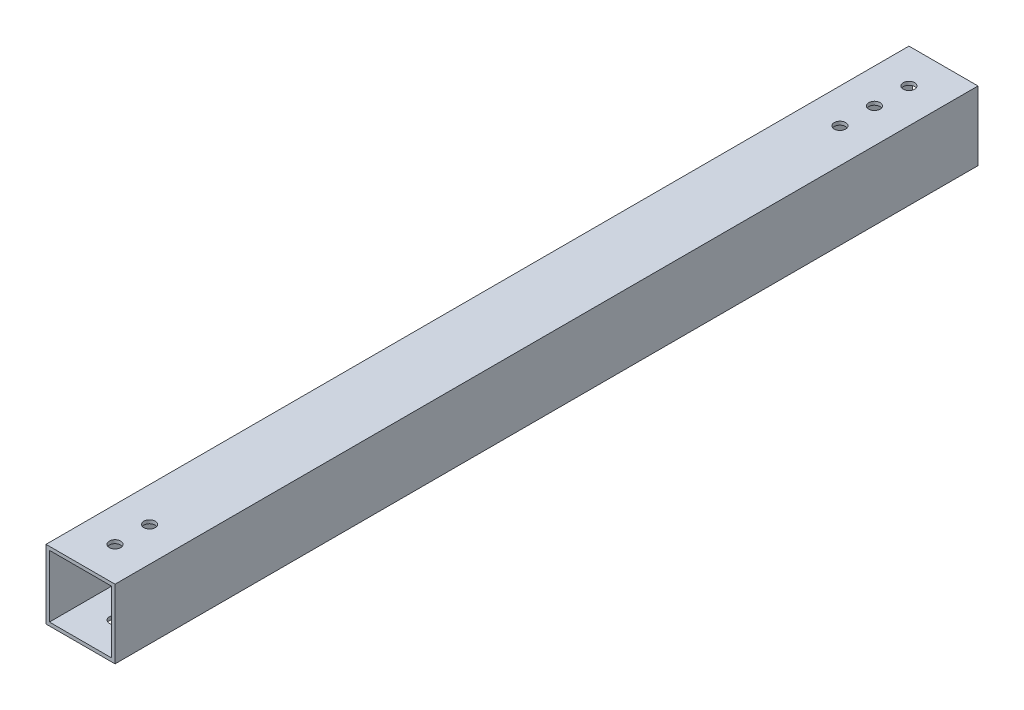
ISO-10303-21;
HEADER;
FILE_DESCRIPTION(('STEP AP214'),'2;1');
FILE_NAME('part.step','',(''),(''),'','','');
FILE_SCHEMA(('AUTOMOTIVE_DESIGN { 1 0 10303 214 1 1 1 1 }'));
ENDSEC;
DATA;
#1=APPLICATION_CONTEXT('core data for automotive mechanical design processes');
#2=APPLICATION_PROTOCOL_DEFINITION('international standard','automotive_design',2000,#1);
#3=PRODUCT_CONTEXT('',#1,'mechanical');
#4=PRODUCT('Part','Part','',(#3));
#5=PRODUCT_RELATED_PRODUCT_CATEGORY('part','',(#4));
#6=PRODUCT_DEFINITION_FORMATION('','',#4);
#7=PRODUCT_DEFINITION_CONTEXT('part definition',#1,'design');
#8=PRODUCT_DEFINITION('design','',#6,#7);
#9=PRODUCT_DEFINITION_SHAPE('','',#8);
#10=(LENGTH_UNIT() NAMED_UNIT(*) SI_UNIT(.MILLI.,.METRE.));
#11=(NAMED_UNIT(*) PLANE_ANGLE_UNIT() SI_UNIT($,.RADIAN.));
#12=(NAMED_UNIT(*) SI_UNIT($,.STERADIAN.) SOLID_ANGLE_UNIT());
#13=UNCERTAINTY_MEASURE_WITH_UNIT(LENGTH_MEASURE(1.E-05),#10,'distance_accuracy_value','');
#14=(GEOMETRIC_REPRESENTATION_CONTEXT(3) GLOBAL_UNCERTAINTY_ASSIGNED_CONTEXT((#13)) GLOBAL_UNIT_ASSIGNED_CONTEXT((#10,
#11,#12)) REPRESENTATION_CONTEXT('',''));
#15=CARTESIAN_POINT('',(0.,0.,0.));
#16=DIRECTION('',(0.,0.,1.));
#17=DIRECTION('',(1.,0.,0.));
#18=AXIS2_PLACEMENT_3D('',#15,#16,#17);
#19=CARTESIAN_POINT('',(0.,0.,250.));
#20=DIRECTION('',(0.,0.,1.));
#21=DIRECTION('',(1.,0.,0.));
#22=AXIS2_PLACEMENT_3D('',#19,#20,#21);
#23=PLANE('',#22);
#24=DIRECTION('',(0.,1.,0.));
#25=VECTOR('',#24,1.);
#26=CARTESIAN_POINT('',(10.,10.,250.));
#27=LINE('',#26,#25);
#28=CARTESIAN_POINT('',(10.,-10.,250.));
#29=VERTEX_POINT('',#28);
#30=CARTESIAN_POINT('',(10.,10.,250.));
#31=VERTEX_POINT('',#30);
#32=EDGE_CURVE('E146',#29,#31,#27,.T.);
#33=ORIENTED_EDGE('',*,*,#32,.T.);
#34=DIRECTION('',(-1.,0.,0.));
#35=VECTOR('',#34,1.);
#36=CARTESIAN_POINT('',(-10.,10.,250.));
#37=LINE('',#36,#35);
#38=CARTESIAN_POINT('',(-10.,10.,250.));
#39=VERTEX_POINT('',#38);
#40=EDGE_CURVE('E149',#31,#39,#37,.T.);
#41=ORIENTED_EDGE('',*,*,#40,.T.);
#42=DIRECTION('',(0.,-1.,0.));
#43=VECTOR('',#42,1.);
#44=CARTESIAN_POINT('',(-10.,10.,250.));
#45=LINE('',#44,#43);
#46=CARTESIAN_POINT('',(-10.,-10.,250.));
#47=VERTEX_POINT('',#46);
#48=EDGE_CURVE('E152',#39,#47,#45,.T.);
#49=ORIENTED_EDGE('',*,*,#48,.T.);
#50=DIRECTION('',(1.,0.,0.));
#51=VECTOR('',#50,1.);
#52=CARTESIAN_POINT('',(-10.,-10.,250.));
#53=LINE('',#52,#51);
#54=EDGE_CURVE('E154',#47,#29,#53,.T.);
#55=ORIENTED_EDGE('',*,*,#54,.T.);
#56=EDGE_LOOP('',(#33,#41,#49,#55));
#57=FACE_BOUND('',#56,.T.);
#58=DIRECTION('',(-1.,0.,0.));
#59=VECTOR('',#58,1.);
#60=CARTESIAN_POINT('',(-9.00000000000001,9.,250.));
#61=LINE('',#60,#59);
#62=CARTESIAN_POINT('',(8.99999999999999,9.,250.));
#63=VERTEX_POINT('',#62);
#64=CARTESIAN_POINT('',(-9.00000000000001,9.,250.));
#65=VERTEX_POINT('',#64);
#66=EDGE_CURVE('E116',#63,#65,#61,.T.);
#67=ORIENTED_EDGE('',*,*,#66,.F.);
#68=DIRECTION('',(0.,1.,0.));
#69=VECTOR('',#68,1.);
#70=CARTESIAN_POINT('',(8.99999999999999,9.,250.));
#71=LINE('',#70,#69);
#72=CARTESIAN_POINT('',(9.,-9.,250.));
#73=VERTEX_POINT('',#72);
#74=EDGE_CURVE('E108',#73,#63,#71,.T.);
#75=ORIENTED_EDGE('',*,*,#74,.F.);
#76=DIRECTION('',(1.,0.,0.));
#77=VECTOR('',#76,1.);
#78=CARTESIAN_POINT('',(-9.,-9.,250.));
#79=LINE('',#78,#77);
#80=CARTESIAN_POINT('',(-9.,-9.,250.));
#81=VERTEX_POINT('',#80);
#82=EDGE_CURVE('E130',#81,#73,#79,.T.);
#83=ORIENTED_EDGE('',*,*,#82,.F.);
#84=DIRECTION('',(0.,-1.,0.));
#85=VECTOR('',#84,1.);
#86=CARTESIAN_POINT('',(-9.00000000000001,9.,250.));
#87=LINE('',#86,#85);
#88=EDGE_CURVE('E128',#65,#81,#87,.T.);
#89=ORIENTED_EDGE('',*,*,#88,.F.);
#90=EDGE_LOOP('',(#67,#75,#83,#89));
#91=FACE_BOUND('',#90,.T.);
#92=ADVANCED_FACE('F41',(#57,#91),#23,.T.);
#93=CARTESIAN_POINT('',(0.,0.,0.));
#94=DIRECTION('',(0.,0.,1.));
#95=DIRECTION('',(1.,0.,0.));
#96=AXIS2_PLACEMENT_3D('',#93,#94,#95);
#97=PLANE('',#96);
#98=DIRECTION('',(0.,1.,0.));
#99=VECTOR('',#98,1.);
#100=CARTESIAN_POINT('',(10.,10.,0.));
#101=LINE('',#100,#99);
#102=CARTESIAN_POINT('',(10.,-10.,0.));
#103=VERTEX_POINT('',#102);
#104=CARTESIAN_POINT('',(10.,10.,0.));
#105=VERTEX_POINT('',#104);
#106=EDGE_CURVE('E124',#103,#105,#101,.T.);
#107=ORIENTED_EDGE('',*,*,#106,.F.);
#108=DIRECTION('',(1.,0.,0.));
#109=VECTOR('',#108,1.);
#110=CARTESIAN_POINT('',(-10.,-10.,0.));
#111=LINE('',#110,#109);
#112=CARTESIAN_POINT('',(-10.,-10.,0.));
#113=VERTEX_POINT('',#112);
#114=EDGE_CURVE('E150',#113,#103,#111,.T.);
#115=ORIENTED_EDGE('',*,*,#114,.F.);
#116=DIRECTION('',(0.,-1.,0.));
#117=VECTOR('',#116,1.);
#118=CARTESIAN_POINT('',(-10.,10.,0.));
#119=LINE('',#118,#117);
#120=CARTESIAN_POINT('',(-10.,10.,0.));
#121=VERTEX_POINT('',#120);
#122=EDGE_CURVE('E161',#121,#113,#119,.T.);
#123=ORIENTED_EDGE('',*,*,#122,.F.);
#124=DIRECTION('',(-1.,0.,0.));
#125=VECTOR('',#124,1.);
#126=CARTESIAN_POINT('',(-10.,10.,0.));
#127=LINE('',#126,#125);
#128=EDGE_CURVE('E159',#105,#121,#127,.T.);
#129=ORIENTED_EDGE('',*,*,#128,.F.);
#130=EDGE_LOOP('',(#107,#115,#123,#129));
#131=FACE_BOUND('',#130,.T.);
#132=DIRECTION('',(0.,1.,0.));
#133=VECTOR('',#132,1.);
#134=CARTESIAN_POINT('',(8.99999999999999,9.,0.));
#135=LINE('',#134,#133);
#136=CARTESIAN_POINT('',(9.,-9.,0.));
#137=VERTEX_POINT('',#136);
#138=CARTESIAN_POINT('',(8.99999999999999,9.,0.));
#139=VERTEX_POINT('',#138);
#140=EDGE_CURVE('E66',#137,#139,#135,.T.);
#141=ORIENTED_EDGE('',*,*,#140,.T.);
#142=DIRECTION('',(-1.,0.,0.));
#143=VECTOR('',#142,1.);
#144=CARTESIAN_POINT('',(-9.00000000000001,9.,0.));
#145=LINE('',#144,#143);
#146=CARTESIAN_POINT('',(-9.00000000000001,9.,0.));
#147=VERTEX_POINT('',#146);
#148=EDGE_CURVE('E123',#139,#147,#145,.T.);
#149=ORIENTED_EDGE('',*,*,#148,.T.);
#150=DIRECTION('',(0.,-1.,0.));
#151=VECTOR('',#150,1.);
#152=CARTESIAN_POINT('',(-9.00000000000001,9.,0.));
#153=LINE('',#152,#151);
#154=CARTESIAN_POINT('',(-9.,-9.,0.));
#155=VERTEX_POINT('',#154);
#156=EDGE_CURVE('E138',#147,#155,#153,.T.);
#157=ORIENTED_EDGE('',*,*,#156,.T.);
#158=DIRECTION('',(1.,0.,0.));
#159=VECTOR('',#158,1.);
#160=CARTESIAN_POINT('',(-9.,-9.,0.));
#161=LINE('',#160,#159);
#162=EDGE_CURVE('E117',#155,#137,#161,.T.);
#163=ORIENTED_EDGE('',*,*,#162,.T.);
#164=EDGE_LOOP('',(#141,#149,#157,#163));
#165=FACE_BOUND('',#164,.T.);
#166=ADVANCED_FACE('F219',(#131,#165),#97,.F.);
#167=CARTESIAN_POINT('',(10.,10.,250.));
#168=DIRECTION('',(-1.,0.,0.));
#169=DIRECTION('',(0.,-1.,0.));
#170=AXIS2_PLACEMENT_3D('',#167,#168,#169);
#171=PLANE('',#170);
#172=ORIENTED_EDGE('',*,*,#106,.T.);
#173=DIRECTION('',(0.,0.,-1.));
#174=VECTOR('',#173,1.);
#175=CARTESIAN_POINT('',(10.,10.,250.));
#176=LINE('',#175,#174);
#177=EDGE_CURVE('E11',#31,#105,#176,.T.);
#178=ORIENTED_EDGE('',*,*,#177,.F.);
#179=ORIENTED_EDGE('',*,*,#32,.F.);
#180=DIRECTION('',(0.,0.,-1.));
#181=VECTOR('',#180,1.);
#182=CARTESIAN_POINT('',(10.,-10.,250.));
#183=LINE('',#182,#181);
#184=EDGE_CURVE('E156',#29,#103,#183,.T.);
#185=ORIENTED_EDGE('',*,*,#184,.T.);
#186=EDGE_LOOP('',(#172,#178,#179,#185));
#187=FACE_BOUND('',#186,.T.);
#188=ADVANCED_FACE('F43',(#187),#171,.F.);
#189=CARTESIAN_POINT('',(-10.,10.,250.));
#190=DIRECTION('',(0.,-1.,0.));
#191=DIRECTION('',(0.,0.,-1.));
#192=AXIS2_PLACEMENT_3D('',#189,#190,#191);
#193=PLANE('',#192);
#194=CARTESIAN_POINT('',(0.,10.,10.));
#195=DIRECTION('',(0.,1.,0.));
#196=DIRECTION('',(0.,0.,1.));
#197=AXIS2_PLACEMENT_3D('',#194,#195,#196);
#198=CIRCLE('',#197,1.65);
#199=CARTESIAN_POINT('',(0.,10.,11.65));
#200=VERTEX_POINT('',#199);
#201=EDGE_CURVE('E256',#200,#200,#198,.T.);
#202=ORIENTED_EDGE('',*,*,#201,.F.);
#203=EDGE_LOOP('',(#202));
#204=FACE_BOUND('',#203,.T.);
#205=CARTESIAN_POINT('',(0.,10.,20.));
#206=DIRECTION('',(0.,1.,0.));
#207=DIRECTION('',(0.,0.,1.));
#208=AXIS2_PLACEMENT_3D('',#205,#206,#207);
#209=CIRCLE('',#208,1.65);
#210=CARTESIAN_POINT('',(0.,10.,21.65));
#211=VERTEX_POINT('',#210);
#212=EDGE_CURVE('E260',#211,#211,#209,.T.);
#213=ORIENTED_EDGE('',*,*,#212,.F.);
#214=EDGE_LOOP('',(#213));
#215=FACE_BOUND('',#214,.T.);
#216=CARTESIAN_POINT('',(0.,10.,30.));
#217=DIRECTION('',(0.,1.,0.));
#218=DIRECTION('',(0.,0.,1.));
#219=AXIS2_PLACEMENT_3D('',#216,#217,#218);
#220=CIRCLE('',#219,1.65);
#221=CARTESIAN_POINT('',(0.,10.,31.65));
#222=VERTEX_POINT('',#221);
#223=EDGE_CURVE('E264',#222,#222,#220,.T.);
#224=ORIENTED_EDGE('',*,*,#223,.F.);
#225=EDGE_LOOP('',(#224));
#226=FACE_BOUND('',#225,.T.);
#227=CARTESIAN_POINT('',(0.,10.,240.));
#228=DIRECTION('',(0.,1.,0.));
#229=DIRECTION('',(0.,0.,1.));
#230=AXIS2_PLACEMENT_3D('',#227,#228,#229);
#231=CIRCLE('',#230,1.65000000000001);
#232=CARTESIAN_POINT('',(0.,10.,241.65));
#233=VERTEX_POINT('',#232);
#234=EDGE_CURVE('E268',#233,#233,#231,.T.);
#235=ORIENTED_EDGE('',*,*,#234,.F.);
#236=EDGE_LOOP('',(#235));
#237=FACE_BOUND('',#236,.T.);
#238=CARTESIAN_POINT('',(0.,10.,230.));
#239=DIRECTION('',(0.,1.,0.));
#240=DIRECTION('',(0.,0.,1.));
#241=AXIS2_PLACEMENT_3D('',#238,#239,#240);
#242=CIRCLE('',#241,1.65000000000001);
#243=CARTESIAN_POINT('',(0.,10.,231.65));
#244=VERTEX_POINT('',#243);
#245=EDGE_CURVE('E272',#244,#244,#242,.T.);
#246=ORIENTED_EDGE('',*,*,#245,.F.);
#247=EDGE_LOOP('',(#246));
#248=FACE_BOUND('',#247,.T.);
#249=ORIENTED_EDGE('',*,*,#128,.T.);
#250=DIRECTION('',(0.,0.,-1.));
#251=VECTOR('',#250,1.);
#252=CARTESIAN_POINT('',(-10.,10.,250.));
#253=LINE('',#252,#251);
#254=EDGE_CURVE('E50',#39,#121,#253,.T.);
#255=ORIENTED_EDGE('',*,*,#254,.F.);
#256=ORIENTED_EDGE('',*,*,#40,.F.);
#257=ORIENTED_EDGE('',*,*,#177,.T.);
#258=EDGE_LOOP('',(#249,#255,#256,#257));
#259=FACE_BOUND('',#258,.T.);
#260=ADVANCED_FACE('F246',(#204,#215,#226,#237,#248,#259),#193,.F.);
#261=CARTESIAN_POINT('',(-10.,10.,250.));
#262=DIRECTION('',(1.,0.,0.));
#263=DIRECTION('',(0.,1.,0.));
#264=AXIS2_PLACEMENT_3D('',#261,#262,#263);
#265=PLANE('',#264);
#266=ORIENTED_EDGE('',*,*,#122,.T.);
#267=DIRECTION('',(0.,0.,-1.));
#268=VECTOR('',#267,1.);
#269=CARTESIAN_POINT('',(-10.,-10.,250.));
#270=LINE('',#269,#268);
#271=EDGE_CURVE('E166',#47,#113,#270,.T.);
#272=ORIENTED_EDGE('',*,*,#271,.F.);
#273=ORIENTED_EDGE('',*,*,#48,.F.);
#274=ORIENTED_EDGE('',*,*,#254,.T.);
#275=EDGE_LOOP('',(#266,#272,#273,#274));
#276=FACE_BOUND('',#275,.T.);
#277=ADVANCED_FACE('F243',(#276),#265,.F.);
#278=CARTESIAN_POINT('',(-10.,-10.,250.));
#279=DIRECTION('',(0.,1.,0.));
#280=DIRECTION('',(0.,0.,1.));
#281=AXIS2_PLACEMENT_3D('',#278,#279,#280);
#282=PLANE('',#281);
#283=CARTESIAN_POINT('',(0.,-10.,10.));
#284=DIRECTION('',(0.,1.,0.));
#285=DIRECTION('',(0.,0.,1.));
#286=AXIS2_PLACEMENT_3D('',#283,#284,#285);
#287=CIRCLE('',#286,1.65);
#288=CARTESIAN_POINT('',(0.,-10.,11.65));
#289=VERTEX_POINT('',#288);
#290=EDGE_CURVE('E175',#289,#289,#287,.T.);
#291=ORIENTED_EDGE('',*,*,#290,.T.);
#292=EDGE_LOOP('',(#291));
#293=FACE_BOUND('',#292,.T.);
#294=CARTESIAN_POINT('',(0.,-10.,20.));
#295=DIRECTION('',(0.,1.,0.));
#296=DIRECTION('',(0.,0.,1.));
#297=AXIS2_PLACEMENT_3D('',#294,#295,#296);
#298=CIRCLE('',#297,1.65);
#299=CARTESIAN_POINT('',(0.,-10.,21.65));
#300=VERTEX_POINT('',#299);
#301=EDGE_CURVE('E342',#300,#300,#298,.T.);
#302=ORIENTED_EDGE('',*,*,#301,.T.);
#303=EDGE_LOOP('',(#302));
#304=FACE_BOUND('',#303,.T.);
#305=CARTESIAN_POINT('',(0.,-10.,30.));
#306=DIRECTION('',(0.,1.,0.));
#307=DIRECTION('',(0.,0.,1.));
#308=AXIS2_PLACEMENT_3D('',#305,#306,#307);
#309=CIRCLE('',#308,1.65);
#310=CARTESIAN_POINT('',(0.,-10.,31.65));
#311=VERTEX_POINT('',#310);
#312=EDGE_CURVE('E350',#311,#311,#309,.T.);
#313=ORIENTED_EDGE('',*,*,#312,.T.);
#314=EDGE_LOOP('',(#313));
#315=FACE_BOUND('',#314,.T.);
#316=CARTESIAN_POINT('',(0.,-10.,240.));
#317=DIRECTION('',(0.,1.,0.));
#318=DIRECTION('',(0.,0.,1.));
#319=AXIS2_PLACEMENT_3D('',#316,#317,#318);
#320=CIRCLE('',#319,1.65000000000001);
#321=CARTESIAN_POINT('',(0.,-10.,241.65));
#322=VERTEX_POINT('',#321);
#323=EDGE_CURVE('E285',#322,#322,#320,.T.);
#324=ORIENTED_EDGE('',*,*,#323,.T.);
#325=EDGE_LOOP('',(#324));
#326=FACE_BOUND('',#325,.T.);
#327=CARTESIAN_POINT('',(0.,-10.,230.));
#328=DIRECTION('',(0.,1.,0.));
#329=DIRECTION('',(0.,0.,1.));
#330=AXIS2_PLACEMENT_3D('',#327,#328,#329);
#331=CIRCLE('',#330,1.65000000000001);
#332=CARTESIAN_POINT('',(0.,-10.,231.65));
#333=VERTEX_POINT('',#332);
#334=EDGE_CURVE('E286',#333,#333,#331,.T.);
#335=ORIENTED_EDGE('',*,*,#334,.T.);
#336=EDGE_LOOP('',(#335));
#337=FACE_BOUND('',#336,.T.);
#338=ORIENTED_EDGE('',*,*,#114,.T.);
#339=ORIENTED_EDGE('',*,*,#184,.F.);
#340=ORIENTED_EDGE('',*,*,#54,.F.);
#341=ORIENTED_EDGE('',*,*,#271,.T.);
#342=EDGE_LOOP('',(#338,#339,#340,#341));
#343=FACE_BOUND('',#342,.T.);
#344=ADVANCED_FACE('F240',(#293,#304,#315,#326,#337,#343),#282,.F.);
#345=CARTESIAN_POINT('',(8.99999999999999,9.,250.));
#346=DIRECTION('',(-1.,0.,0.));
#347=DIRECTION('',(0.,-1.,0.));
#348=AXIS2_PLACEMENT_3D('',#345,#346,#347);
#349=PLANE('',#348);
#350=ORIENTED_EDGE('',*,*,#140,.F.);
#351=DIRECTION('',(0.,0.,-1.));
#352=VECTOR('',#351,1.);
#353=CARTESIAN_POINT('',(9.,-9.,250.));
#354=LINE('',#353,#352);
#355=EDGE_CURVE('E112',#73,#137,#354,.T.);
#356=ORIENTED_EDGE('',*,*,#355,.F.);
#357=ORIENTED_EDGE('',*,*,#74,.T.);
#358=DIRECTION('',(0.,0.,-1.));
#359=VECTOR('',#358,1.);
#360=CARTESIAN_POINT('',(8.99999999999999,9.,250.));
#361=LINE('',#360,#359);
#362=EDGE_CURVE('E111',#63,#139,#361,.T.);
#363=ORIENTED_EDGE('',*,*,#362,.T.);
#364=EDGE_LOOP('',(#350,#356,#357,#363));
#365=FACE_BOUND('',#364,.T.);
#366=ADVANCED_FACE('F110',(#365),#349,.T.);
#367=CARTESIAN_POINT('',(-9.00000000000001,9.,250.));
#368=DIRECTION('',(0.,-1.,0.));
#369=DIRECTION('',(0.,0.,-1.));
#370=AXIS2_PLACEMENT_3D('',#367,#368,#369);
#371=PLANE('',#370);
#372=CARTESIAN_POINT('',(0.,9.,10.));
#373=DIRECTION('',(0.,-1.,0.));
#374=DIRECTION('',(0.,0.,-1.));
#375=AXIS2_PLACEMENT_3D('',#372,#373,#374);
#376=CIRCLE('',#375,1.65);
#377=CARTESIAN_POINT('',(0.,9.,8.35));
#378=VERTEX_POINT('',#377);
#379=EDGE_CURVE('E136',#378,#378,#376,.T.);
#380=ORIENTED_EDGE('',*,*,#379,.F.);
#381=EDGE_LOOP('',(#380));
#382=FACE_BOUND('',#381,.T.);
#383=CARTESIAN_POINT('',(0.,9.,20.));
#384=DIRECTION('',(0.,-1.,0.));
#385=DIRECTION('',(0.,0.,-1.));
#386=AXIS2_PLACEMENT_3D('',#383,#384,#385);
#387=CIRCLE('',#386,1.65);
#388=CARTESIAN_POINT('',(0.,9.,18.35));
#389=VERTEX_POINT('',#388);
#390=EDGE_CURVE('E185',#389,#389,#387,.T.);
#391=ORIENTED_EDGE('',*,*,#390,.F.);
#392=EDGE_LOOP('',(#391));
#393=FACE_BOUND('',#392,.T.);
#394=CARTESIAN_POINT('',(0.,9.,30.));
#395=DIRECTION('',(0.,-1.,0.));
#396=DIRECTION('',(0.,0.,-1.));
#397=AXIS2_PLACEMENT_3D('',#394,#395,#396);
#398=CIRCLE('',#397,1.65);
#399=CARTESIAN_POINT('',(0.,9.,28.35));
#400=VERTEX_POINT('',#399);
#401=EDGE_CURVE('E182',#400,#400,#398,.T.);
#402=ORIENTED_EDGE('',*,*,#401,.F.);
#403=EDGE_LOOP('',(#402));
#404=FACE_BOUND('',#403,.T.);
#405=CARTESIAN_POINT('',(0.,9.,240.));
#406=DIRECTION('',(0.,-1.,0.));
#407=DIRECTION('',(0.,0.,-1.));
#408=AXIS2_PLACEMENT_3D('',#405,#406,#407);
#409=CIRCLE('',#408,1.65000000000001);
#410=CARTESIAN_POINT('',(0.,9.,238.35));
#411=VERTEX_POINT('',#410);
#412=EDGE_CURVE('E179',#411,#411,#409,.T.);
#413=ORIENTED_EDGE('',*,*,#412,.F.);
#414=EDGE_LOOP('',(#413));
#415=FACE_BOUND('',#414,.T.);
#416=CARTESIAN_POINT('',(0.,9.,230.));
#417=DIRECTION('',(0.,-1.,0.));
#418=DIRECTION('',(0.,0.,-1.));
#419=AXIS2_PLACEMENT_3D('',#416,#417,#418);
#420=CIRCLE('',#419,1.65000000000001);
#421=CARTESIAN_POINT('',(0.,9.,228.35));
#422=VERTEX_POINT('',#421);
#423=EDGE_CURVE('E174',#422,#422,#420,.T.);
#424=ORIENTED_EDGE('',*,*,#423,.F.);
#425=EDGE_LOOP('',(#424));
#426=FACE_BOUND('',#425,.T.);
#427=ORIENTED_EDGE('',*,*,#148,.F.);
#428=ORIENTED_EDGE('',*,*,#362,.F.);
#429=ORIENTED_EDGE('',*,*,#66,.T.);
#430=DIRECTION('',(0.,0.,-1.));
#431=VECTOR('',#430,1.);
#432=CARTESIAN_POINT('',(-9.00000000000001,9.,250.));
#433=LINE('',#432,#431);
#434=EDGE_CURVE('E125',#65,#147,#433,.T.);
#435=ORIENTED_EDGE('',*,*,#434,.T.);
#436=EDGE_LOOP('',(#427,#428,#429,#435));
#437=FACE_BOUND('',#436,.T.);
#438=ADVANCED_FACE('F120',(#382,#393,#404,#415,#426,#437),#371,.T.);
#439=CARTESIAN_POINT('',(-9.00000000000001,9.,250.));
#440=DIRECTION('',(1.,0.,0.));
#441=DIRECTION('',(0.,1.,0.));
#442=AXIS2_PLACEMENT_3D('',#439,#440,#441);
#443=PLANE('',#442);
#444=ORIENTED_EDGE('',*,*,#156,.F.);
#445=ORIENTED_EDGE('',*,*,#434,.F.);
#446=ORIENTED_EDGE('',*,*,#88,.T.);
#447=DIRECTION('',(0.,0.,-1.));
#448=VECTOR('',#447,1.);
#449=CARTESIAN_POINT('',(-9.,-9.,250.));
#450=LINE('',#449,#448);
#451=EDGE_CURVE('E58',#81,#155,#450,.T.);
#452=ORIENTED_EDGE('',*,*,#451,.T.);
#453=EDGE_LOOP('',(#444,#445,#446,#452));
#454=FACE_BOUND('',#453,.T.);
#455=ADVANCED_FACE('F209',(#454),#443,.T.);
#456=CARTESIAN_POINT('',(-9.,-9.,250.));
#457=DIRECTION('',(0.,1.,0.));
#458=DIRECTION('',(0.,0.,1.));
#459=AXIS2_PLACEMENT_3D('',#456,#457,#458);
#460=PLANE('',#459);
#461=CARTESIAN_POINT('',(0.,-9.,10.));
#462=DIRECTION('',(0.,1.,0.));
#463=DIRECTION('',(0.,0.,1.));
#464=AXIS2_PLACEMENT_3D('',#461,#462,#463);
#465=CIRCLE('',#464,1.65);
#466=CARTESIAN_POINT('',(0.,-9.,11.65));
#467=VERTEX_POINT('',#466);
#468=EDGE_CURVE('E45',#467,#467,#465,.T.);
#469=ORIENTED_EDGE('',*,*,#468,.F.);
#470=EDGE_LOOP('',(#469));
#471=FACE_BOUND('',#470,.T.);
#472=CARTESIAN_POINT('',(0.,-9.,20.));
#473=DIRECTION('',(0.,1.,0.));
#474=DIRECTION('',(0.,0.,1.));
#475=AXIS2_PLACEMENT_3D('',#472,#473,#474);
#476=CIRCLE('',#475,1.65);
#477=CARTESIAN_POINT('',(0.,-9.,21.65));
#478=VERTEX_POINT('',#477);
#479=EDGE_CURVE('E183',#478,#478,#476,.T.);
#480=ORIENTED_EDGE('',*,*,#479,.F.);
#481=EDGE_LOOP('',(#480));
#482=FACE_BOUND('',#481,.T.);
#483=CARTESIAN_POINT('',(0.,-9.,30.));
#484=DIRECTION('',(0.,1.,0.));
#485=DIRECTION('',(0.,0.,1.));
#486=AXIS2_PLACEMENT_3D('',#483,#484,#485);
#487=CIRCLE('',#486,1.65);
#488=CARTESIAN_POINT('',(0.,-9.,31.65));
#489=VERTEX_POINT('',#488);
#490=EDGE_CURVE('E180',#489,#489,#487,.T.);
#491=ORIENTED_EDGE('',*,*,#490,.F.);
#492=EDGE_LOOP('',(#491));
#493=FACE_BOUND('',#492,.T.);
#494=CARTESIAN_POINT('',(0.,-9.,240.));
#495=DIRECTION('',(0.,1.,0.));
#496=DIRECTION('',(0.,0.,1.));
#497=AXIS2_PLACEMENT_3D('',#494,#495,#496);
#498=CIRCLE('',#497,1.65000000000001);
#499=CARTESIAN_POINT('',(0.,-9.,241.65));
#500=VERTEX_POINT('',#499);
#501=EDGE_CURVE('E176',#500,#500,#498,.T.);
#502=ORIENTED_EDGE('',*,*,#501,.F.);
#503=EDGE_LOOP('',(#502));
#504=FACE_BOUND('',#503,.T.);
#505=CARTESIAN_POINT('',(0.,-9.,230.));
#506=DIRECTION('',(0.,1.,0.));
#507=DIRECTION('',(0.,0.,1.));
#508=AXIS2_PLACEMENT_3D('',#505,#506,#507);
#509=CIRCLE('',#508,1.65000000000001);
#510=CARTESIAN_POINT('',(0.,-9.,231.65));
#511=VERTEX_POINT('',#510);
#512=EDGE_CURVE('E171',#511,#511,#509,.T.);
#513=ORIENTED_EDGE('',*,*,#512,.F.);
#514=EDGE_LOOP('',(#513));
#515=FACE_BOUND('',#514,.T.);
#516=ORIENTED_EDGE('',*,*,#162,.F.);
#517=ORIENTED_EDGE('',*,*,#451,.F.);
#518=ORIENTED_EDGE('',*,*,#82,.T.);
#519=ORIENTED_EDGE('',*,*,#355,.T.);
#520=EDGE_LOOP('',(#516,#517,#518,#519));
#521=FACE_BOUND('',#520,.T.);
#522=ADVANCED_FACE('F205',(#471,#482,#493,#504,#515,#521),#460,.T.);
#523=CARTESIAN_POINT('',(0.,-10.,230.));
#524=DIRECTION('',(0.,1.,0.));
#525=DIRECTION('',(0.,0.,1.));
#526=AXIS2_PLACEMENT_3D('',#523,#524,#525);
#527=CYLINDRICAL_SURFACE('',#526,1.65000000000001);
#528=ORIENTED_EDGE('',*,*,#512,.T.);
#529=EDGE_LOOP('',(#528));
#530=FACE_BOUND('',#529,.T.);
#531=ORIENTED_EDGE('',*,*,#334,.F.);
#532=EDGE_LOOP('',(#531));
#533=FACE_BOUND('',#532,.T.);
#534=ADVANCED_FACE('F208',(#530,#533),#527,.F.);
#535=CARTESIAN_POINT('',(0.,-10.,240.));
#536=DIRECTION('',(0.,1.,0.));
#537=DIRECTION('',(0.,0.,1.));
#538=AXIS2_PLACEMENT_3D('',#535,#536,#537);
#539=CYLINDRICAL_SURFACE('',#538,1.65000000000001);
#540=ORIENTED_EDGE('',*,*,#501,.T.);
#541=EDGE_LOOP('',(#540));
#542=FACE_BOUND('',#541,.T.);
#543=ORIENTED_EDGE('',*,*,#323,.F.);
#544=EDGE_LOOP('',(#543));
#545=FACE_BOUND('',#544,.T.);
#546=ADVANCED_FACE('F308',(#542,#545),#539,.F.);
#547=CARTESIAN_POINT('',(0.,-10.,30.));
#548=DIRECTION('',(0.,1.,0.));
#549=DIRECTION('',(0.,0.,1.));
#550=AXIS2_PLACEMENT_3D('',#547,#548,#549);
#551=CYLINDRICAL_SURFACE('',#550,1.65);
#552=ORIENTED_EDGE('',*,*,#490,.T.);
#553=EDGE_LOOP('',(#552));
#554=FACE_BOUND('',#553,.T.);
#555=ORIENTED_EDGE('',*,*,#312,.F.);
#556=EDGE_LOOP('',(#555));
#557=FACE_BOUND('',#556,.T.);
#558=ADVANCED_FACE('F317',(#554,#557),#551,.F.);
#559=CARTESIAN_POINT('',(0.,-10.,20.));
#560=DIRECTION('',(0.,1.,0.));
#561=DIRECTION('',(0.,0.,1.));
#562=AXIS2_PLACEMENT_3D('',#559,#560,#561);
#563=CYLINDRICAL_SURFACE('',#562,1.65);
#564=ORIENTED_EDGE('',*,*,#479,.T.);
#565=EDGE_LOOP('',(#564));
#566=FACE_BOUND('',#565,.T.);
#567=ORIENTED_EDGE('',*,*,#301,.F.);
#568=EDGE_LOOP('',(#567));
#569=FACE_BOUND('',#568,.T.);
#570=ADVANCED_FACE('F309',(#566,#569),#563,.F.);
#571=CARTESIAN_POINT('',(0.,-10.,10.));
#572=DIRECTION('',(0.,1.,0.));
#573=DIRECTION('',(0.,0.,1.));
#574=AXIS2_PLACEMENT_3D('',#571,#572,#573);
#575=CYLINDRICAL_SURFACE('',#574,1.65);
#576=ORIENTED_EDGE('',*,*,#468,.T.);
#577=EDGE_LOOP('',(#576));
#578=FACE_BOUND('',#577,.T.);
#579=ORIENTED_EDGE('',*,*,#290,.F.);
#580=EDGE_LOOP('',(#579));
#581=FACE_BOUND('',#580,.T.);
#582=ADVANCED_FACE('F202',(#578,#581),#575,.F.);
#583=ORIENTED_EDGE('',*,*,#423,.T.);
#584=EDGE_LOOP('',(#583));
#585=FACE_BOUND('',#584,.T.);
#586=ORIENTED_EDGE('',*,*,#245,.T.);
#587=EDGE_LOOP('',(#586));
#588=FACE_BOUND('',#587,.T.);
#589=ADVANCED_FACE('F296',(#585,#588),#527,.F.);
#590=ORIENTED_EDGE('',*,*,#412,.T.);
#591=EDGE_LOOP('',(#590));
#592=FACE_BOUND('',#591,.T.);
#593=ORIENTED_EDGE('',*,*,#234,.T.);
#594=EDGE_LOOP('',(#593));
#595=FACE_BOUND('',#594,.T.);
#596=ADVANCED_FACE('F299',(#592,#595),#539,.F.);
#597=ORIENTED_EDGE('',*,*,#401,.T.);
#598=EDGE_LOOP('',(#597));
#599=FACE_BOUND('',#598,.T.);
#600=ORIENTED_EDGE('',*,*,#223,.T.);
#601=EDGE_LOOP('',(#600));
#602=FACE_BOUND('',#601,.T.);
#603=ADVANCED_FACE('F305',(#599,#602),#551,.F.);
#604=ORIENTED_EDGE('',*,*,#390,.T.);
#605=EDGE_LOOP('',(#604));
#606=FACE_BOUND('',#605,.T.);
#607=ORIENTED_EDGE('',*,*,#212,.T.);
#608=EDGE_LOOP('',(#607));
#609=FACE_BOUND('',#608,.T.);
#610=ADVANCED_FACE('F330',(#606,#609),#563,.F.);
#611=ORIENTED_EDGE('',*,*,#379,.T.);
#612=EDGE_LOOP('',(#611));
#613=FACE_BOUND('',#612,.T.);
#614=ORIENTED_EDGE('',*,*,#201,.T.);
#615=EDGE_LOOP('',(#614));
#616=FACE_BOUND('',#615,.T.);
#617=ADVANCED_FACE('F311',(#613,#616),#575,.F.);
#618=CLOSED_SHELL('',(#92,#166,#188,#260,#277,#344,#366,#438,#455,#522,#534,#546,#558,#570,#582,
#589,#596,#603,#610,#617));
#619=MANIFOLD_SOLID_BREP('B2',#618);
#620=ADVANCED_BREP_SHAPE_REPRESENTATION('',(#18,#619),#14);
#621=SHAPE_DEFINITION_REPRESENTATION(#9,#620);
ENDSEC;
END-ISO-10303-21;
